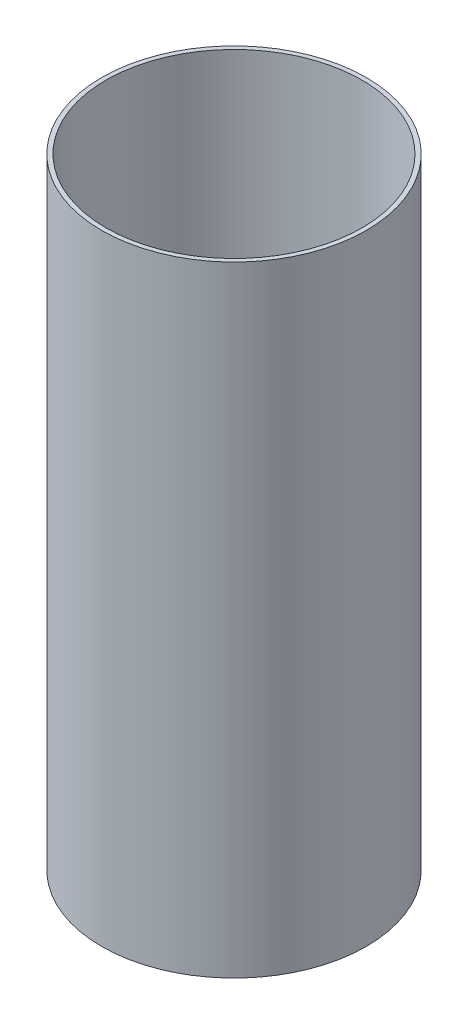
ISO-10303-21;
HEADER;
FILE_DESCRIPTION(('STEP AP214'),'2;1');
FILE_NAME('part.step','',(''),(''),'','','');
FILE_SCHEMA(('AUTOMOTIVE_DESIGN { 1 0 10303 214 1 1 1 1 }'));
ENDSEC;
DATA;
#1=APPLICATION_CONTEXT('core data for automotive mechanical design processes');
#2=APPLICATION_PROTOCOL_DEFINITION('international standard','automotive_design',2000,#1);
#3=PRODUCT_CONTEXT('',#1,'mechanical');
#4=PRODUCT('Part','Part','',(#3));
#5=PRODUCT_RELATED_PRODUCT_CATEGORY('part','',(#4));
#6=PRODUCT_DEFINITION_FORMATION('','',#4);
#7=PRODUCT_DEFINITION_CONTEXT('part definition',#1,'design');
#8=PRODUCT_DEFINITION('design','',#6,#7);
#9=PRODUCT_DEFINITION_SHAPE('','',#8);
#10=(LENGTH_UNIT() NAMED_UNIT(*) SI_UNIT(.MILLI.,.METRE.));
#11=(NAMED_UNIT(*) PLANE_ANGLE_UNIT() SI_UNIT($,.RADIAN.));
#12=(NAMED_UNIT(*) SI_UNIT($,.STERADIAN.) SOLID_ANGLE_UNIT());
#13=UNCERTAINTY_MEASURE_WITH_UNIT(LENGTH_MEASURE(1.E-05),#10,'distance_accuracy_value','');
#14=(GEOMETRIC_REPRESENTATION_CONTEXT(3) GLOBAL_UNCERTAINTY_ASSIGNED_CONTEXT((#13)) GLOBAL_UNIT_ASSIGNED_CONTEXT((#10,
#11,#12)) REPRESENTATION_CONTEXT('',''));
#15=CARTESIAN_POINT('',(0.,0.,0.));
#16=DIRECTION('',(0.,0.,1.));
#17=DIRECTION('',(1.,0.,0.));
#18=AXIS2_PLACEMENT_3D('',#15,#16,#17);
#19=CARTESIAN_POINT('',(0.,356.,0.));
#20=DIRECTION('',(0.,1.,0.));
#21=DIRECTION('',(0.,0.,1.));
#22=AXIS2_PLACEMENT_3D('',#19,#20,#21);
#23=PLANE('',#22);
#24=CARTESIAN_POINT('',(0.,356.,0.));
#25=DIRECTION('',(0.,1.,0.));
#26=DIRECTION('',(0.,0.,1.));
#27=AXIS2_PLACEMENT_3D('',#24,#25,#26);
#28=CIRCLE('',#27,76.);
#29=CARTESIAN_POINT('',(0.,356.,76.));
#30=VERTEX_POINT('',#29);
#31=EDGE_CURVE('E10',#30,#30,#28,.T.);
#32=ORIENTED_EDGE('',*,*,#31,.T.);
#33=EDGE_LOOP('',(#32));
#34=FACE_BOUND('',#33,.T.);
#35=CARTESIAN_POINT('',(0.,356.,0.));
#36=DIRECTION('',(0.,1.,0.));
#37=DIRECTION('',(0.,0.,1.));
#38=AXIS2_PLACEMENT_3D('',#35,#36,#37);
#39=CIRCLE('',#38,73.5);
#40=CARTESIAN_POINT('',(0.,356.,73.5));
#41=VERTEX_POINT('',#40);
#42=EDGE_CURVE('E56',#41,#41,#39,.T.);
#43=ORIENTED_EDGE('',*,*,#42,.F.);
#44=EDGE_LOOP('',(#43));
#45=FACE_BOUND('',#44,.T.);
#46=ADVANCED_FACE('F43',(#34,#45),#23,.T.);
#47=CARTESIAN_POINT('',(0.,0.,0.));
#48=DIRECTION('',(0.,1.,0.));
#49=DIRECTION('',(0.,0.,1.));
#50=AXIS2_PLACEMENT_3D('',#47,#48,#49);
#51=PLANE('',#50);
#52=CARTESIAN_POINT('',(0.,0.,0.));
#53=DIRECTION('',(0.,1.,0.));
#54=DIRECTION('',(0.,0.,1.));
#55=AXIS2_PLACEMENT_3D('',#52,#53,#54);
#56=CIRCLE('',#55,76.);
#57=CARTESIAN_POINT('',(0.,0.,76.));
#58=VERTEX_POINT('',#57);
#59=EDGE_CURVE('E47',#58,#58,#56,.T.);
#60=ORIENTED_EDGE('',*,*,#59,.F.);
#61=EDGE_LOOP('',(#60));
#62=FACE_BOUND('',#61,.T.);
#63=CARTESIAN_POINT('',(0.,0.,0.));
#64=DIRECTION('',(0.,1.,0.));
#65=DIRECTION('',(0.,0.,1.));
#66=AXIS2_PLACEMENT_3D('',#63,#64,#65);
#67=CIRCLE('',#66,73.5);
#68=CARTESIAN_POINT('',(0.,0.,73.5));
#69=VERTEX_POINT('',#68);
#70=EDGE_CURVE('E58',#69,#69,#67,.T.);
#71=ORIENTED_EDGE('',*,*,#70,.T.);
#72=EDGE_LOOP('',(#71));
#73=FACE_BOUND('',#72,.T.);
#74=ADVANCED_FACE('F70',(#62,#73),#51,.F.);
#75=CARTESIAN_POINT('',(0.,356.,0.));
#76=DIRECTION('',(0.,-1.,0.));
#77=DIRECTION('',(0.,0.,-1.));
#78=AXIS2_PLACEMENT_3D('',#75,#76,#77);
#79=CYLINDRICAL_SURFACE('',#78,76.);
#80=ORIENTED_EDGE('',*,*,#31,.F.);
#81=EDGE_LOOP('',(#80));
#82=FACE_BOUND('',#81,.T.);
#83=ORIENTED_EDGE('',*,*,#59,.T.);
#84=EDGE_LOOP('',(#83));
#85=FACE_BOUND('',#84,.T.);
#86=ADVANCED_FACE('F45',(#82,#85),#79,.T.);
#87=CARTESIAN_POINT('',(0.,356.,0.));
#88=DIRECTION('',(0.,-1.,0.));
#89=DIRECTION('',(0.,0.,-1.));
#90=AXIS2_PLACEMENT_3D('',#87,#88,#89);
#91=CYLINDRICAL_SURFACE('',#90,73.5);
#92=ORIENTED_EDGE('',*,*,#42,.T.);
#93=EDGE_LOOP('',(#92));
#94=FACE_BOUND('',#93,.T.);
#95=ORIENTED_EDGE('',*,*,#70,.F.);
#96=EDGE_LOOP('',(#95));
#97=FACE_BOUND('',#96,.T.);
#98=ADVANCED_FACE('F66',(#94,#97),#91,.F.);
#99=CLOSED_SHELL('',(#46,#74,#86,#98));
#100=MANIFOLD_SOLID_BREP('B2',#99);
#101=ADVANCED_BREP_SHAPE_REPRESENTATION('',(#18,#100),#14);
#102=SHAPE_DEFINITION_REPRESENTATION(#9,#101);
ENDSEC;
END-ISO-10303-21;
